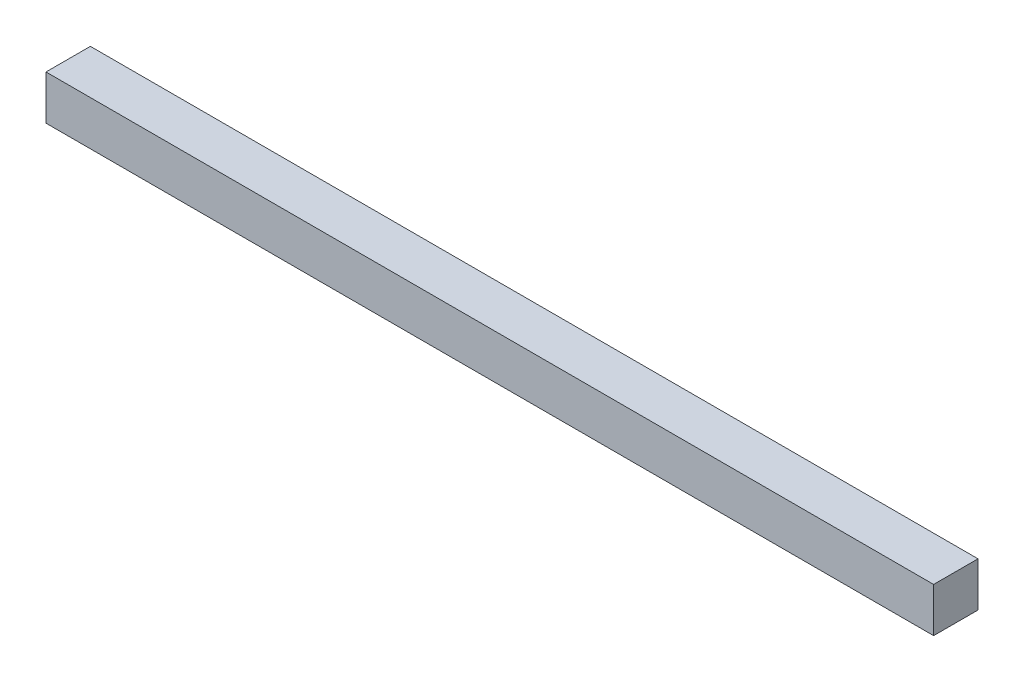
ISO-10303-21;
HEADER;
FILE_DESCRIPTION(('STEP AP214'),'2;1');
FILE_NAME('part.step','',(''),(''),'','','');
FILE_SCHEMA(('AUTOMOTIVE_DESIGN { 1 0 10303 214 1 1 1 1 }'));
ENDSEC;
DATA;
#1=APPLICATION_CONTEXT('core data for automotive mechanical design processes');
#2=APPLICATION_PROTOCOL_DEFINITION('international standard','automotive_design',2000,#1);
#3=PRODUCT_CONTEXT('',#1,'mechanical');
#4=PRODUCT('Part','Part','',(#3));
#5=PRODUCT_RELATED_PRODUCT_CATEGORY('part','',(#4));
#6=PRODUCT_DEFINITION_FORMATION('','',#4);
#7=PRODUCT_DEFINITION_CONTEXT('part definition',#1,'design');
#8=PRODUCT_DEFINITION('design','',#6,#7);
#9=PRODUCT_DEFINITION_SHAPE('','',#8);
#10=(LENGTH_UNIT() NAMED_UNIT(*) SI_UNIT(.MILLI.,.METRE.));
#11=(NAMED_UNIT(*) PLANE_ANGLE_UNIT() SI_UNIT($,.RADIAN.));
#12=(NAMED_UNIT(*) SI_UNIT($,.STERADIAN.) SOLID_ANGLE_UNIT());
#13=UNCERTAINTY_MEASURE_WITH_UNIT(LENGTH_MEASURE(1.E-05),#10,'distance_accuracy_value','');
#14=(GEOMETRIC_REPRESENTATION_CONTEXT(3) GLOBAL_UNCERTAINTY_ASSIGNED_CONTEXT((#13)) GLOBAL_UNIT_ASSIGNED_CONTEXT((#10,
#11,#12)) REPRESENTATION_CONTEXT('',''));
#15=CARTESIAN_POINT('',(0.,0.,0.));
#16=DIRECTION('',(0.,0.,1.));
#17=DIRECTION('',(1.,0.,0.));
#18=AXIS2_PLACEMENT_3D('',#15,#16,#17);
#19=CARTESIAN_POINT('',(400.,-10.,-10.));
#20=DIRECTION('',(0.,0.,1.));
#21=DIRECTION('',(1.,0.,0.));
#22=AXIS2_PLACEMENT_3D('',#19,#20,#21);
#23=PLANE('',#22);
#24=DIRECTION('',(0.,1.,0.));
#25=VECTOR('',#24,1.);
#26=CARTESIAN_POINT('',(0.,-10.,-10.));
#27=LINE('',#26,#25);
#28=CARTESIAN_POINT('',(0.,-10.,-10.));
#29=VERTEX_POINT('',#28);
#30=CARTESIAN_POINT('',(0.,10.,-10.));
#31=VERTEX_POINT('',#30);
#32=EDGE_CURVE('E96',#29,#31,#27,.T.);
#33=ORIENTED_EDGE('',*,*,#32,.T.);
#34=DIRECTION('',(-1.,0.,0.));
#35=VECTOR('',#34,1.);
#36=CARTESIAN_POINT('',(400.,10.,-10.));
#37=LINE('',#36,#35);
#38=CARTESIAN_POINT('',(400.,10.,-10.));
#39=VERTEX_POINT('',#38);
#40=EDGE_CURVE('E11',#39,#31,#37,.T.);
#41=ORIENTED_EDGE('',*,*,#40,.F.);
#42=DIRECTION('',(0.,1.,0.));
#43=VECTOR('',#42,1.);
#44=CARTESIAN_POINT('',(400.,-10.,-10.));
#45=LINE('',#44,#43);
#46=CARTESIAN_POINT('',(400.,-10.,-10.));
#47=VERTEX_POINT('',#46);
#48=EDGE_CURVE('E84',#47,#39,#45,.T.);
#49=ORIENTED_EDGE('',*,*,#48,.F.);
#50=DIRECTION('',(-1.,0.,0.));
#51=VECTOR('',#50,1.);
#52=CARTESIAN_POINT('',(400.,-10.,-10.));
#53=LINE('',#52,#51);
#54=EDGE_CURVE('E92',#47,#29,#53,.T.);
#55=ORIENTED_EDGE('',*,*,#54,.T.);
#56=EDGE_LOOP('',(#33,#41,#49,#55));
#57=FACE_BOUND('',#56,.T.);
#58=ADVANCED_FACE('F33',(#57),#23,.F.);
#59=CARTESIAN_POINT('',(400.,10.,10.));
#60=DIRECTION('',(0.,-1.,0.));
#61=DIRECTION('',(0.,0.,-1.));
#62=AXIS2_PLACEMENT_3D('',#59,#60,#61);
#63=PLANE('',#62);
#64=DIRECTION('',(0.,0.,1.));
#65=VECTOR('',#64,1.);
#66=CARTESIAN_POINT('',(0.,10.,10.));
#67=LINE('',#66,#65);
#68=CARTESIAN_POINT('',(0.,10.,10.));
#69=VERTEX_POINT('',#68);
#70=EDGE_CURVE('E88',#31,#69,#67,.T.);
#71=ORIENTED_EDGE('',*,*,#70,.T.);
#72=DIRECTION('',(-1.,0.,0.));
#73=VECTOR('',#72,1.);
#74=CARTESIAN_POINT('',(400.,10.,10.));
#75=LINE('',#74,#73);
#76=CARTESIAN_POINT('',(400.,10.,10.));
#77=VERTEX_POINT('',#76);
#78=EDGE_CURVE('E41',#77,#69,#75,.T.);
#79=ORIENTED_EDGE('',*,*,#78,.F.);
#80=DIRECTION('',(0.,0.,1.));
#81=VECTOR('',#80,1.);
#82=CARTESIAN_POINT('',(400.,10.,10.));
#83=LINE('',#82,#81);
#84=EDGE_CURVE('E79',#39,#77,#83,.T.);
#85=ORIENTED_EDGE('',*,*,#84,.F.);
#86=ORIENTED_EDGE('',*,*,#40,.T.);
#87=EDGE_LOOP('',(#71,#79,#85,#86));
#88=FACE_BOUND('',#87,.T.);
#89=ADVANCED_FACE('F87',(#88),#63,.F.);
#90=CARTESIAN_POINT('',(400.,-10.,10.));
#91=DIRECTION('',(0.,0.,-1.));
#92=DIRECTION('',(-1.,0.,0.));
#93=AXIS2_PLACEMENT_3D('',#90,#91,#92);
#94=PLANE('',#93);
#95=DIRECTION('',(0.,-1.,0.));
#96=VECTOR('',#95,1.);
#97=CARTESIAN_POINT('',(0.,-10.,10.));
#98=LINE('',#97,#96);
#99=CARTESIAN_POINT('',(0.,-10.,10.));
#100=VERTEX_POINT('',#99);
#101=EDGE_CURVE('E66',#69,#100,#98,.T.);
#102=ORIENTED_EDGE('',*,*,#101,.T.);
#103=DIRECTION('',(-1.,0.,0.));
#104=VECTOR('',#103,1.);
#105=CARTESIAN_POINT('',(400.,-10.,10.));
#106=LINE('',#105,#104);
#107=CARTESIAN_POINT('',(400.,-10.,10.));
#108=VERTEX_POINT('',#107);
#109=EDGE_CURVE('E89',#108,#100,#106,.T.);
#110=ORIENTED_EDGE('',*,*,#109,.F.);
#111=DIRECTION('',(0.,-1.,0.));
#112=VECTOR('',#111,1.);
#113=CARTESIAN_POINT('',(400.,-10.,10.));
#114=LINE('',#113,#112);
#115=EDGE_CURVE('E82',#77,#108,#114,.T.);
#116=ORIENTED_EDGE('',*,*,#115,.F.);
#117=ORIENTED_EDGE('',*,*,#78,.T.);
#118=EDGE_LOOP('',(#102,#110,#116,#117));
#119=FACE_BOUND('',#118,.T.);
#120=ADVANCED_FACE('F90',(#119),#94,.F.);
#121=CARTESIAN_POINT('',(400.,-10.,10.));
#122=DIRECTION('',(0.,1.,0.));
#123=DIRECTION('',(0.,0.,1.));
#124=AXIS2_PLACEMENT_3D('',#121,#122,#123);
#125=PLANE('',#124);
#126=DIRECTION('',(0.,0.,-1.));
#127=VECTOR('',#126,1.);
#128=CARTESIAN_POINT('',(0.,-10.,10.));
#129=LINE('',#128,#127);
#130=EDGE_CURVE('E72',#100,#29,#129,.T.);
#131=ORIENTED_EDGE('',*,*,#130,.T.);
#132=ORIENTED_EDGE('',*,*,#54,.F.);
#133=DIRECTION('',(0.,0.,-1.));
#134=VECTOR('',#133,1.);
#135=CARTESIAN_POINT('',(400.,-10.,10.));
#136=LINE('',#135,#134);
#137=EDGE_CURVE('E49',#108,#47,#136,.T.);
#138=ORIENTED_EDGE('',*,*,#137,.F.);
#139=ORIENTED_EDGE('',*,*,#109,.T.);
#140=EDGE_LOOP('',(#131,#132,#138,#139));
#141=FACE_BOUND('',#140,.T.);
#142=ADVANCED_FACE('F103',(#141),#125,.F.);
#143=CARTESIAN_POINT('',(400.,0.,0.));
#144=DIRECTION('',(-1.,0.,0.));
#145=DIRECTION('',(0.,0.,1.));
#146=AXIS2_PLACEMENT_3D('',#143,#144,#145);
#147=PLANE('',#146);
#148=ORIENTED_EDGE('',*,*,#48,.T.);
#149=ORIENTED_EDGE('',*,*,#84,.T.);
#150=ORIENTED_EDGE('',*,*,#115,.T.);
#151=ORIENTED_EDGE('',*,*,#137,.T.);
#152=EDGE_LOOP('',(#148,#149,#150,#151));
#153=FACE_BOUND('',#152,.T.);
#154=ADVANCED_FACE('F80',(#153),#147,.F.);
#155=CARTESIAN_POINT('',(0.,0.,0.));
#156=DIRECTION('',(-1.,0.,0.));
#157=DIRECTION('',(0.,0.,1.));
#158=AXIS2_PLACEMENT_3D('',#155,#156,#157);
#159=PLANE('',#158);
#160=ORIENTED_EDGE('',*,*,#32,.F.);
#161=ORIENTED_EDGE('',*,*,#130,.F.);
#162=ORIENTED_EDGE('',*,*,#101,.F.);
#163=ORIENTED_EDGE('',*,*,#70,.F.);
#164=EDGE_LOOP('',(#160,#161,#162,#163));
#165=FACE_BOUND('',#164,.T.);
#166=ADVANCED_FACE('F106',(#165),#159,.T.);
#167=CLOSED_SHELL('',(#58,#89,#120,#142,#154,#166));
#168=MANIFOLD_SOLID_BREP('B2',#167);
#169=ADVANCED_BREP_SHAPE_REPRESENTATION('',(#18,#168),#14);
#170=SHAPE_DEFINITION_REPRESENTATION(#9,#169);
ENDSEC;
END-ISO-10303-21;
